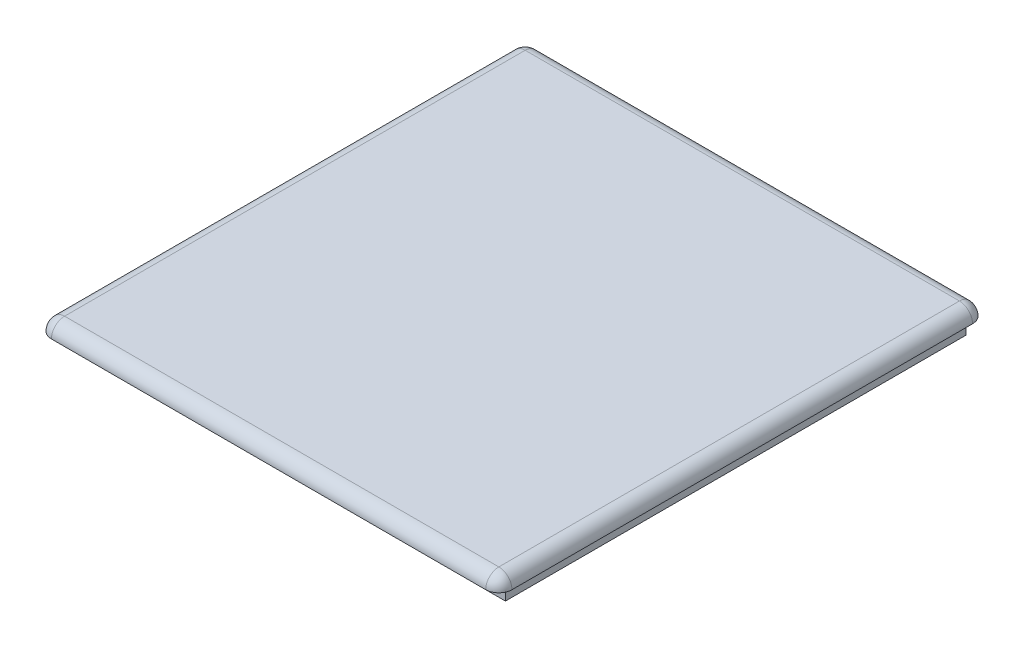
ISO-10303-21;
HEADER;
FILE_DESCRIPTION(('STEP AP214'),'2;1');
FILE_NAME('part.step','',(''),(''),'','','');
FILE_SCHEMA(('AUTOMOTIVE_DESIGN { 1 0 10303 214 1 1 1 1 }'));
ENDSEC;
DATA;
#1=APPLICATION_CONTEXT('core data for automotive mechanical design processes');
#2=APPLICATION_PROTOCOL_DEFINITION('international standard','automotive_design',2000,#1);
#3=PRODUCT_CONTEXT('',#1,'mechanical');
#4=PRODUCT('Part','Part','',(#3));
#5=PRODUCT_RELATED_PRODUCT_CATEGORY('part','',(#4));
#6=PRODUCT_DEFINITION_FORMATION('','',#4);
#7=PRODUCT_DEFINITION_CONTEXT('part definition',#1,'design');
#8=PRODUCT_DEFINITION('design','',#6,#7);
#9=PRODUCT_DEFINITION_SHAPE('','',#8);
#10=(LENGTH_UNIT() NAMED_UNIT(*) SI_UNIT(.MILLI.,.METRE.));
#11=(NAMED_UNIT(*) PLANE_ANGLE_UNIT() SI_UNIT($,.RADIAN.));
#12=(NAMED_UNIT(*) SI_UNIT($,.STERADIAN.) SOLID_ANGLE_UNIT());
#13=UNCERTAINTY_MEASURE_WITH_UNIT(LENGTH_MEASURE(1.E-05),#10,'distance_accuracy_value','');
#14=(GEOMETRIC_REPRESENTATION_CONTEXT(3) GLOBAL_UNCERTAINTY_ASSIGNED_CONTEXT((#13)) GLOBAL_UNIT_ASSIGNED_CONTEXT((#10,
#11,#12)) REPRESENTATION_CONTEXT('',''));
#15=CARTESIAN_POINT('',(0.,0.,0.));
#16=DIRECTION('',(0.,0.,1.));
#17=DIRECTION('',(1.,0.,0.));
#18=AXIS2_PLACEMENT_3D('',#15,#16,#17);
#19=CARTESIAN_POINT('',(-16.6829268292683,1.,-20.2241379310345));
#20=DIRECTION('',(1.,0.,0.));
#21=DIRECTION('',(0.,0.,-1.));
#22=AXIS2_PLACEMENT_3D('',#19,#20,#21);
#23=PLANE('',#22);
#24=DIRECTION('',(0.,0.,1.));
#25=VECTOR('',#24,1.);
#26=CARTESIAN_POINT('',(-16.6829268292683,0.,-20.2241379310345));
#27=LINE('',#26,#25);
#28=CARTESIAN_POINT('',(-16.6829268292683,0.,-20.2241379310345));
#29=VERTEX_POINT('',#28);
#30=CARTESIAN_POINT('',(-16.6829268292683,0.,14.7758620689655));
#31=VERTEX_POINT('',#30);
#32=EDGE_CURVE('E140',#29,#31,#27,.T.);
#33=ORIENTED_EDGE('',*,*,#32,.T.);
#34=DIRECTION('',(0.,-1.,0.));
#35=VECTOR('',#34,1.);
#36=CARTESIAN_POINT('',(-16.6829268292683,1.,14.7758620689655));
#37=LINE('',#36,#35);
#38=CARTESIAN_POINT('',(-16.6829268292683,1.,14.7758620689655));
#39=VERTEX_POINT('',#38);
#40=EDGE_CURVE('E117',#39,#31,#37,.T.);
#41=ORIENTED_EDGE('',*,*,#40,.F.);
#42=DIRECTION('',(0.,0.,1.));
#43=VECTOR('',#42,1.);
#44=CARTESIAN_POINT('',(-16.6829268292683,1.,-20.2241379310345));
#45=LINE('',#44,#43);
#46=CARTESIAN_POINT('',(-16.6829268292683,1.,-20.2241379310345));
#47=VERTEX_POINT('',#46);
#48=EDGE_CURVE('E111',#47,#39,#45,.T.);
#49=ORIENTED_EDGE('',*,*,#48,.F.);
#50=DIRECTION('',(0.,-1.,0.));
#51=VECTOR('',#50,1.);
#52=CARTESIAN_POINT('',(-16.6829268292683,1.,-20.2241379310345));
#53=LINE('',#52,#51);
#54=EDGE_CURVE('E114',#47,#29,#53,.T.);
#55=ORIENTED_EDGE('',*,*,#54,.T.);
#56=EDGE_LOOP('',(#33,#41,#49,#55));
#57=FACE_BOUND('',#56,.T.);
#58=ADVANCED_FACE('F33',(#57),#23,.F.);
#59=CARTESIAN_POINT('',(-16.6829268292683,1.,14.7758620689655));
#60=DIRECTION('',(0.,0.,-1.));
#61=DIRECTION('',(-1.,0.,0.));
#62=AXIS2_PLACEMENT_3D('',#59,#60,#61);
#63=PLANE('',#62);
#64=DIRECTION('',(1.,0.,0.));
#65=VECTOR('',#64,1.);
#66=CARTESIAN_POINT('',(-16.6829268292683,0.,14.7758620689655));
#67=LINE('',#66,#65);
#68=CARTESIAN_POINT('',(17.3170731707317,0.,14.7758620689655));
#69=VERTEX_POINT('',#68);
#70=EDGE_CURVE('E142',#31,#69,#67,.T.);
#71=ORIENTED_EDGE('',*,*,#70,.T.);
#72=DIRECTION('',(0.,-1.,0.));
#73=VECTOR('',#72,1.);
#74=CARTESIAN_POINT('',(17.3170731707317,1.,14.7758620689655));
#75=LINE('',#74,#73);
#76=CARTESIAN_POINT('',(17.3170731707317,1.,14.7758620689655));
#77=VERTEX_POINT('',#76);
#78=EDGE_CURVE('E149',#77,#69,#75,.T.);
#79=ORIENTED_EDGE('',*,*,#78,.F.);
#80=DIRECTION('',(1.,0.,0.));
#81=VECTOR('',#80,1.);
#82=CARTESIAN_POINT('',(-16.6829268292683,1.,14.7758620689655));
#83=LINE('',#82,#81);
#84=EDGE_CURVE('E121',#39,#77,#83,.T.);
#85=ORIENTED_EDGE('',*,*,#84,.F.);
#86=ORIENTED_EDGE('',*,*,#40,.T.);
#87=EDGE_LOOP('',(#71,#79,#85,#86));
#88=FACE_BOUND('',#87,.T.);
#89=ADVANCED_FACE('F203',(#88),#63,.F.);
#90=CARTESIAN_POINT('',(17.3170731707317,1.,-20.2241379310345));
#91=DIRECTION('',(-1.,0.,0.));
#92=DIRECTION('',(0.,0.,1.));
#93=AXIS2_PLACEMENT_3D('',#90,#91,#92);
#94=PLANE('',#93);
#95=DIRECTION('',(0.,0.,-1.));
#96=VECTOR('',#95,1.);
#97=CARTESIAN_POINT('',(17.3170731707317,0.,-20.2241379310345));
#98=LINE('',#97,#96);
#99=CARTESIAN_POINT('',(17.3170731707317,0.,-20.2241379310345));
#100=VERTEX_POINT('',#99);
#101=EDGE_CURVE('E145',#69,#100,#98,.T.);
#102=ORIENTED_EDGE('',*,*,#101,.T.);
#103=DIRECTION('',(0.,-1.,0.));
#104=VECTOR('',#103,1.);
#105=CARTESIAN_POINT('',(17.3170731707317,1.,-20.2241379310345));
#106=LINE('',#105,#104);
#107=CARTESIAN_POINT('',(17.3170731707317,1.,-20.2241379310345));
#108=VERTEX_POINT('',#107);
#109=EDGE_CURVE('E131',#108,#100,#106,.T.);
#110=ORIENTED_EDGE('',*,*,#109,.F.);
#111=DIRECTION('',(0.,0.,-1.));
#112=VECTOR('',#111,1.);
#113=CARTESIAN_POINT('',(17.3170731707317,1.,-20.2241379310345));
#114=LINE('',#113,#112);
#115=EDGE_CURVE('E135',#77,#108,#114,.T.);
#116=ORIENTED_EDGE('',*,*,#115,.F.);
#117=ORIENTED_EDGE('',*,*,#78,.T.);
#118=EDGE_LOOP('',(#102,#110,#116,#117));
#119=FACE_BOUND('',#118,.T.);
#120=ADVANCED_FACE('F206',(#119),#94,.F.);
#121=CARTESIAN_POINT('',(-16.6829268292683,1.,-20.2241379310345));
#122=DIRECTION('',(0.,0.,1.));
#123=DIRECTION('',(1.,0.,0.));
#124=AXIS2_PLACEMENT_3D('',#121,#122,#123);
#125=PLANE('',#124);
#126=DIRECTION('',(-1.,0.,0.));
#127=VECTOR('',#126,1.);
#128=CARTESIAN_POINT('',(-16.6829268292683,0.,-20.2241379310345));
#129=LINE('',#128,#127);
#130=EDGE_CURVE('E122',#100,#29,#129,.T.);
#131=ORIENTED_EDGE('',*,*,#130,.T.);
#132=ORIENTED_EDGE('',*,*,#54,.F.);
#133=DIRECTION('',(-1.,0.,0.));
#134=VECTOR('',#133,1.);
#135=CARTESIAN_POINT('',(-16.6829268292683,1.,-20.2241379310345));
#136=LINE('',#135,#134);
#137=EDGE_CURVE('E128',#108,#47,#136,.T.);
#138=ORIENTED_EDGE('',*,*,#137,.F.);
#139=ORIENTED_EDGE('',*,*,#109,.T.);
#140=EDGE_LOOP('',(#131,#132,#138,#139));
#141=FACE_BOUND('',#140,.T.);
#142=ADVANCED_FACE('F126',(#141),#125,.F.);
#143=CARTESIAN_POINT('',(0.,0.,0.));
#144=DIRECTION('',(0.,1.,0.));
#145=DIRECTION('',(0.,0.,1.));
#146=AXIS2_PLACEMENT_3D('',#143,#144,#145);
#147=PLANE('',#146);
#148=ORIENTED_EDGE('',*,*,#32,.F.);
#149=ORIENTED_EDGE('',*,*,#130,.F.);
#150=ORIENTED_EDGE('',*,*,#101,.F.);
#151=ORIENTED_EDGE('',*,*,#70,.F.);
#152=EDGE_LOOP('',(#148,#149,#150,#151));
#153=FACE_BOUND('',#152,.T.);
#154=ADVANCED_FACE('F208',(#153),#147,.F.);
#155=CARTESIAN_POINT('',(0.,1.,0.));
#156=DIRECTION('',(0.,1.,0.));
#157=DIRECTION('',(0.,0.,1.));
#158=AXIS2_PLACEMENT_3D('',#155,#156,#157);
#159=PLANE('',#158);
#160=DIRECTION('',(0.,0.,1.));
#161=VECTOR('',#160,1.);
#162=CARTESIAN_POINT('',(-17.1829268292683,1.,-21.2241379310345));
#163=LINE('',#162,#161);
#164=CARTESIAN_POINT('',(-17.1829268292683,1.,-20.2241379310345));
#165=VERTEX_POINT('',#164);
#166=CARTESIAN_POINT('',(-17.1829268292683,1.,14.7758620689655));
#167=VERTEX_POINT('',#166);
#168=EDGE_CURVE('E53',#165,#167,#163,.T.);
#169=ORIENTED_EDGE('',*,*,#168,.F.);
#170=CARTESIAN_POINT('',(-16.1829268292683,1.,-20.2241379310345));
#171=DIRECTION('',(0.,1.,0.));
#172=DIRECTION('',(0.,0.,1.));
#173=AXIS2_PLACEMENT_3D('',#170,#171,#172);
#174=CIRCLE('',#173,1.);
#175=CARTESIAN_POINT('',(-16.1829268292683,1.,-21.2241379310345));
#176=VERTEX_POINT('',#175);
#177=EDGE_CURVE('E11',#165,#176,#174,.F.);
#178=ORIENTED_EDGE('',*,*,#177,.T.);
#179=DIRECTION('',(-1.,0.,0.));
#180=VECTOR('',#179,1.);
#181=CARTESIAN_POINT('',(-17.1829268292683,1.,-21.2241379310345));
#182=LINE('',#181,#180);
#183=CARTESIAN_POINT('',(16.8170731707317,1.,-21.2241379310345));
#184=VERTEX_POINT('',#183);
#185=EDGE_CURVE('E143',#184,#176,#182,.T.);
#186=ORIENTED_EDGE('',*,*,#185,.F.);
#187=CARTESIAN_POINT('',(16.8170731707317,1.,-20.2241379310345));
#188=DIRECTION('',(0.,1.,0.));
#189=DIRECTION('',(0.,0.,1.));
#190=AXIS2_PLACEMENT_3D('',#187,#188,#189);
#191=CIRCLE('',#190,1.);
#192=CARTESIAN_POINT('',(17.8170731707317,1.,-20.2241379310345));
#193=VERTEX_POINT('',#192);
#194=EDGE_CURVE('E42',#184,#193,#191,.F.);
#195=ORIENTED_EDGE('',*,*,#194,.T.);
#196=DIRECTION('',(0.,0.,-1.));
#197=VECTOR('',#196,1.);
#198=CARTESIAN_POINT('',(17.8170731707317,1.,-21.2241379310345));
#199=LINE('',#198,#197);
#200=CARTESIAN_POINT('',(17.8170731707317,1.,14.7758620689655));
#201=VERTEX_POINT('',#200);
#202=EDGE_CURVE('E196',#201,#193,#199,.T.);
#203=ORIENTED_EDGE('',*,*,#202,.F.);
#204=CARTESIAN_POINT('',(16.8170731707317,1.,14.7758620689655));
#205=DIRECTION('',(0.,1.,0.));
#206=DIRECTION('',(0.,0.,1.));
#207=AXIS2_PLACEMENT_3D('',#204,#205,#206);
#208=CIRCLE('',#207,1.);
#209=CARTESIAN_POINT('',(16.8170731707317,1.,15.7758620689655));
#210=VERTEX_POINT('',#209);
#211=EDGE_CURVE('E163',#201,#210,#208,.F.);
#212=ORIENTED_EDGE('',*,*,#211,.T.);
#213=DIRECTION('',(1.,0.,0.));
#214=VECTOR('',#213,1.);
#215=CARTESIAN_POINT('',(-17.1829268292683,1.,15.7758620689655));
#216=LINE('',#215,#214);
#217=CARTESIAN_POINT('',(-16.1829268292683,1.,15.7758620689655));
#218=VERTEX_POINT('',#217);
#219=EDGE_CURVE('E191',#218,#210,#216,.T.);
#220=ORIENTED_EDGE('',*,*,#219,.F.);
#221=CARTESIAN_POINT('',(-16.1829268292683,1.,14.7758620689655));
#222=DIRECTION('',(0.,1.,0.));
#223=DIRECTION('',(0.,0.,1.));
#224=AXIS2_PLACEMENT_3D('',#221,#222,#223);
#225=CIRCLE('',#224,1.);
#226=EDGE_CURVE('E50',#218,#167,#225,.F.);
#227=ORIENTED_EDGE('',*,*,#226,.T.);
#228=EDGE_LOOP('',(#169,#178,#186,#195,#203,#212,#220,#227));
#229=FACE_BOUND('',#228,.T.);
#230=ORIENTED_EDGE('',*,*,#137,.T.);
#231=ORIENTED_EDGE('',*,*,#48,.T.);
#232=ORIENTED_EDGE('',*,*,#84,.T.);
#233=ORIENTED_EDGE('',*,*,#115,.T.);
#234=EDGE_LOOP('',(#230,#231,#232,#233));
#235=FACE_BOUND('',#234,.T.);
#236=ADVANCED_FACE('F133',(#229,#235),#159,.F.);
#237=CARTESIAN_POINT('',(0.,2.,0.));
#238=DIRECTION('',(0.,1.,0.));
#239=DIRECTION('',(0.,0.,1.));
#240=AXIS2_PLACEMENT_3D('',#237,#238,#239);
#241=PLANE('',#240);
#242=DIRECTION('',(0.,0.,1.));
#243=VECTOR('',#242,1.);
#244=CARTESIAN_POINT('',(-16.1829268292683,2.,15.7758620689655));
#245=LINE('',#244,#243);
#246=CARTESIAN_POINT('',(-16.1829268292683,2.,-20.2241379310345));
#247=VERTEX_POINT('',#246);
#248=CARTESIAN_POINT('',(-16.1829268292683,2.,14.7758620689655));
#249=VERTEX_POINT('',#248);
#250=EDGE_CURVE('E153',#247,#249,#245,.T.);
#251=ORIENTED_EDGE('',*,*,#250,.T.);
#252=DIRECTION('',(1.,0.,0.));
#253=VECTOR('',#252,1.);
#254=CARTESIAN_POINT('',(17.8170731707317,2.,14.7758620689655));
#255=LINE('',#254,#253);
#256=CARTESIAN_POINT('',(16.8170731707317,2.,14.7758620689655));
#257=VERTEX_POINT('',#256);
#258=EDGE_CURVE('E159',#249,#257,#255,.T.);
#259=ORIENTED_EDGE('',*,*,#258,.T.);
#260=DIRECTION('',(0.,0.,-1.));
#261=VECTOR('',#260,1.);
#262=CARTESIAN_POINT('',(16.8170731707317,2.,-21.2241379310345));
#263=LINE('',#262,#261);
#264=CARTESIAN_POINT('',(16.8170731707317,2.,-20.2241379310345));
#265=VERTEX_POINT('',#264);
#266=EDGE_CURVE('E157',#257,#265,#263,.T.);
#267=ORIENTED_EDGE('',*,*,#266,.T.);
#268=DIRECTION('',(-1.,0.,0.));
#269=VECTOR('',#268,1.);
#270=CARTESIAN_POINT('',(-17.1829268292683,2.,-20.2241379310345));
#271=LINE('',#270,#269);
#272=EDGE_CURVE('E155',#265,#247,#271,.T.);
#273=ORIENTED_EDGE('',*,*,#272,.T.);
#274=EDGE_LOOP('',(#251,#259,#267,#273));
#275=FACE_BOUND('',#274,.T.);
#276=ADVANCED_FACE('F215',(#275),#241,.T.);
#277=CARTESIAN_POINT('',(0.,1.,-20.2241379310345));
#278=DIRECTION('',(1.,0.,0.));
#279=DIRECTION('',(0.,0.,-1.));
#280=AXIS2_PLACEMENT_3D('',#277,#278,#279);
#281=CYLINDRICAL_SURFACE('',#280,1.);
#282=CARTESIAN_POINT('',(16.8170731707317,1.,-20.2241379310345));
#283=DIRECTION('',(1.,0.,0.));
#284=DIRECTION('',(0.,0.,-1.));
#285=AXIS2_PLACEMENT_3D('',#282,#283,#284);
#286=CIRCLE('',#285,1.);
#287=EDGE_CURVE('E181',#184,#265,#286,.T.);
#288=ORIENTED_EDGE('',*,*,#287,.F.);
#289=ORIENTED_EDGE('',*,*,#185,.T.);
#290=CARTESIAN_POINT('',(-16.1829268292683,1.,-20.2241379310345));
#291=DIRECTION('',(-1.,0.,0.));
#292=DIRECTION('',(0.,0.,1.));
#293=AXIS2_PLACEMENT_3D('',#290,#291,#292);
#294=CIRCLE('',#293,1.);
#295=EDGE_CURVE('E37',#247,#176,#294,.T.);
#296=ORIENTED_EDGE('',*,*,#295,.F.);
#297=ORIENTED_EDGE('',*,*,#272,.F.);
#298=EDGE_LOOP('',(#288,#289,#296,#297));
#299=FACE_BOUND('',#298,.T.);
#300=ADVANCED_FACE('F35',(#299),#281,.T.);
#301=CARTESIAN_POINT('',(-16.1829268292683,1.,-20.2241379310345));
#302=DIRECTION('',(0.,0.,1.));
#303=DIRECTION('',(1.,0.,0.));
#304=AXIS2_PLACEMENT_3D('',#301,#302,#303);
#305=SPHERICAL_SURFACE('',#304,1.);
#306=ORIENTED_EDGE('',*,*,#295,.T.);
#307=ORIENTED_EDGE('',*,*,#177,.F.);
#308=CARTESIAN_POINT('',(-16.1829268292683,1.,-20.2241379310345));
#309=DIRECTION('',(0.,0.,-1.));
#310=DIRECTION('',(-1.,0.,0.));
#311=AXIS2_PLACEMENT_3D('',#308,#309,#310);
#312=CIRCLE('',#311,1.);
#313=EDGE_CURVE('E179',#247,#165,#312,.F.);
#314=ORIENTED_EDGE('',*,*,#313,.F.);
#315=EDGE_LOOP('',(#306,#307,#314));
#316=FACE_BOUND('',#315,.T.);
#317=ADVANCED_FACE('F247',(#316),#305,.T.);
#318=CARTESIAN_POINT('',(16.8170731707317,1.,-20.2241379310345));
#319=DIRECTION('',(0.,0.,1.));
#320=DIRECTION('',(1.,0.,0.));
#321=AXIS2_PLACEMENT_3D('',#318,#319,#320);
#322=SPHERICAL_SURFACE('',#321,1.);
#323=ORIENTED_EDGE('',*,*,#194,.F.);
#324=ORIENTED_EDGE('',*,*,#287,.T.);
#325=CARTESIAN_POINT('',(16.8170731707317,1.,-20.2241379310345));
#326=DIRECTION('',(0.,0.,-1.));
#327=DIRECTION('',(-1.,0.,0.));
#328=AXIS2_PLACEMENT_3D('',#325,#326,#327);
#329=CIRCLE('',#328,1.);
#330=EDGE_CURVE('E176',#193,#265,#329,.F.);
#331=ORIENTED_EDGE('',*,*,#330,.F.);
#332=EDGE_LOOP('',(#323,#324,#331));
#333=FACE_BOUND('',#332,.T.);
#334=ADVANCED_FACE('F245',(#333),#322,.T.);
#335=CARTESIAN_POINT('',(-16.1829268292683,1.,0.));
#336=DIRECTION('',(0.,0.,-1.));
#337=DIRECTION('',(-1.,0.,0.));
#338=AXIS2_PLACEMENT_3D('',#335,#336,#337);
#339=CYLINDRICAL_SURFACE('',#338,1.);
#340=ORIENTED_EDGE('',*,*,#313,.T.);
#341=ORIENTED_EDGE('',*,*,#168,.T.);
#342=CARTESIAN_POINT('',(-16.1829268292683,1.,14.7758620689655));
#343=DIRECTION('',(0.,0.,1.));
#344=DIRECTION('',(1.,0.,0.));
#345=AXIS2_PLACEMENT_3D('',#342,#343,#344);
#346=CIRCLE('',#345,1.);
#347=EDGE_CURVE('E173',#249,#167,#346,.T.);
#348=ORIENTED_EDGE('',*,*,#347,.F.);
#349=ORIENTED_EDGE('',*,*,#250,.F.);
#350=EDGE_LOOP('',(#340,#341,#348,#349));
#351=FACE_BOUND('',#350,.T.);
#352=ADVANCED_FACE('F241',(#351),#339,.T.);
#353=CARTESIAN_POINT('',(16.8170731707317,1.,0.));
#354=DIRECTION('',(0.,0.,1.));
#355=DIRECTION('',(1.,0.,0.));
#356=AXIS2_PLACEMENT_3D('',#353,#354,#355);
#357=CYLINDRICAL_SURFACE('',#356,1.);
#358=ORIENTED_EDGE('',*,*,#330,.T.);
#359=ORIENTED_EDGE('',*,*,#266,.F.);
#360=CARTESIAN_POINT('',(16.8170731707317,1.,14.7758620689655));
#361=DIRECTION('',(0.,0.,1.));
#362=DIRECTION('',(1.,0.,0.));
#363=AXIS2_PLACEMENT_3D('',#360,#361,#362);
#364=CIRCLE('',#363,1.);
#365=EDGE_CURVE('E170',#201,#257,#364,.T.);
#366=ORIENTED_EDGE('',*,*,#365,.F.);
#367=ORIENTED_EDGE('',*,*,#202,.T.);
#368=EDGE_LOOP('',(#358,#359,#366,#367));
#369=FACE_BOUND('',#368,.T.);
#370=ADVANCED_FACE('F237',(#369),#357,.T.);
#371=CARTESIAN_POINT('',(-16.1829268292683,1.,14.7758620689655));
#372=DIRECTION('',(0.,0.,1.));
#373=DIRECTION('',(1.,0.,0.));
#374=AXIS2_PLACEMENT_3D('',#371,#372,#373);
#375=SPHERICAL_SURFACE('',#374,1.);
#376=ORIENTED_EDGE('',*,*,#347,.T.);
#377=ORIENTED_EDGE('',*,*,#226,.F.);
#378=CARTESIAN_POINT('',(-16.1829268292683,1.,14.7758620689655));
#379=DIRECTION('',(-1.,0.,0.));
#380=DIRECTION('',(0.,0.,1.));
#381=AXIS2_PLACEMENT_3D('',#378,#379,#380);
#382=CIRCLE('',#381,1.);
#383=EDGE_CURVE('E168',#249,#218,#382,.F.);
#384=ORIENTED_EDGE('',*,*,#383,.F.);
#385=EDGE_LOOP('',(#376,#377,#384));
#386=FACE_BOUND('',#385,.T.);
#387=ADVANCED_FACE('F233',(#386),#375,.T.);
#388=CARTESIAN_POINT('',(16.8170731707317,1.,14.7758620689655));
#389=DIRECTION('',(0.,0.,1.));
#390=DIRECTION('',(1.,0.,0.));
#391=AXIS2_PLACEMENT_3D('',#388,#389,#390);
#392=SPHERICAL_SURFACE('',#391,1.);
#393=ORIENTED_EDGE('',*,*,#211,.F.);
#394=ORIENTED_EDGE('',*,*,#365,.T.);
#395=CARTESIAN_POINT('',(16.8170731707317,1.,14.7758620689655));
#396=DIRECTION('',(1.,0.,0.));
#397=DIRECTION('',(0.,0.,-1.));
#398=AXIS2_PLACEMENT_3D('',#395,#396,#397);
#399=CIRCLE('',#398,1.);
#400=EDGE_CURVE('E166',#210,#257,#399,.F.);
#401=ORIENTED_EDGE('',*,*,#400,.F.);
#402=EDGE_LOOP('',(#393,#394,#401));
#403=FACE_BOUND('',#402,.T.);
#404=ADVANCED_FACE('F229',(#403),#392,.T.);
#405=CARTESIAN_POINT('',(0.,1.,14.7758620689655));
#406=DIRECTION('',(-1.,0.,0.));
#407=DIRECTION('',(0.,0.,1.));
#408=AXIS2_PLACEMENT_3D('',#405,#406,#407);
#409=CYLINDRICAL_SURFACE('',#408,1.);
#410=ORIENTED_EDGE('',*,*,#383,.T.);
#411=ORIENTED_EDGE('',*,*,#219,.T.);
#412=ORIENTED_EDGE('',*,*,#400,.T.);
#413=ORIENTED_EDGE('',*,*,#258,.F.);
#414=EDGE_LOOP('',(#410,#411,#412,#413));
#415=FACE_BOUND('',#414,.T.);
#416=ADVANCED_FACE('F226',(#415),#409,.T.);
#417=CLOSED_SHELL('',(#58,#89,#120,#142,#154,#236,#276,#300,#317,#334,#352,#370,#387,#404,#416));
#418=MANIFOLD_SOLID_BREP('B2',#417);
#419=ADVANCED_BREP_SHAPE_REPRESENTATION('',(#18,#418),#14);
#420=SHAPE_DEFINITION_REPRESENTATION(#9,#419);
ENDSEC;
END-ISO-10303-21;
